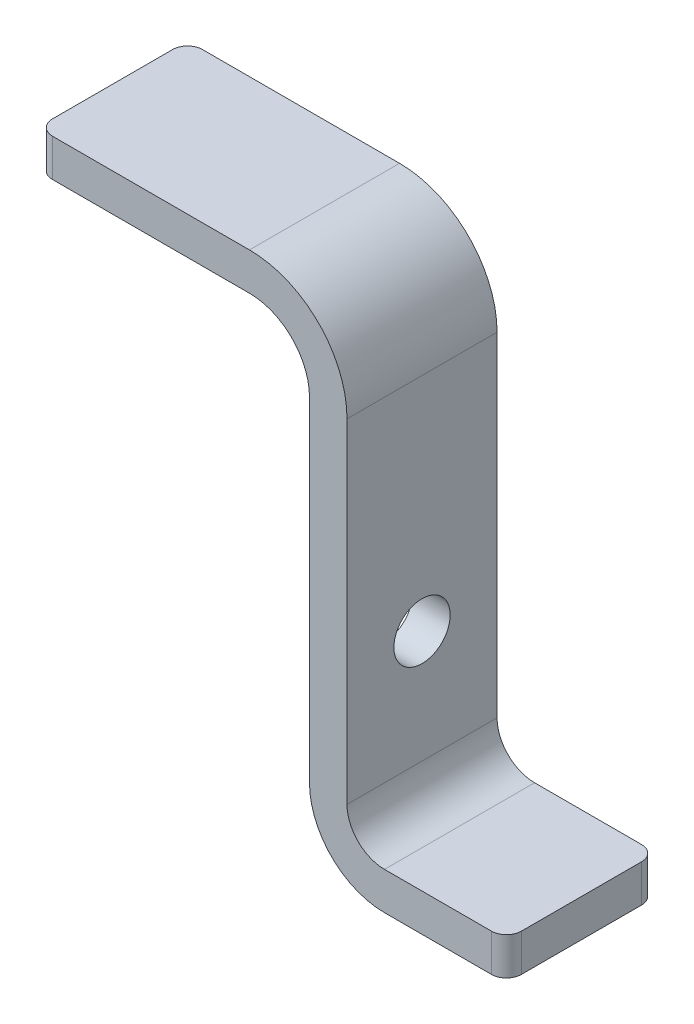
ISO-10303-21;
HEADER;
FILE_DESCRIPTION(('STEP AP214'),'2;1');
FILE_NAME('part.step','',(''),(''),'','','');
FILE_SCHEMA(('AUTOMOTIVE_DESIGN { 1 0 10303 214 1 1 1 1 }'));
ENDSEC;
DATA;
#1=APPLICATION_CONTEXT('core data for automotive mechanical design processes');
#2=APPLICATION_PROTOCOL_DEFINITION('international standard','automotive_design',2000,#1);
#3=PRODUCT_CONTEXT('',#1,'mechanical');
#4=PRODUCT('Part','Part','',(#3));
#5=PRODUCT_RELATED_PRODUCT_CATEGORY('part','',(#4));
#6=PRODUCT_DEFINITION_FORMATION('','',#4);
#7=PRODUCT_DEFINITION_CONTEXT('part definition',#1,'design');
#8=PRODUCT_DEFINITION('design','',#6,#7);
#9=PRODUCT_DEFINITION_SHAPE('','',#8);
#10=(LENGTH_UNIT() NAMED_UNIT(*) SI_UNIT(.MILLI.,.METRE.));
#11=(NAMED_UNIT(*) PLANE_ANGLE_UNIT() SI_UNIT($,.RADIAN.));
#12=(NAMED_UNIT(*) SI_UNIT($,.STERADIAN.) SOLID_ANGLE_UNIT());
#13=UNCERTAINTY_MEASURE_WITH_UNIT(LENGTH_MEASURE(1.E-05),#10,'distance_accuracy_value','');
#14=(GEOMETRIC_REPRESENTATION_CONTEXT(3) GLOBAL_UNCERTAINTY_ASSIGNED_CONTEXT((#13)) GLOBAL_UNIT_ASSIGNED_CONTEXT((#10,
#11,#12)) REPRESENTATION_CONTEXT('',''));
#15=CARTESIAN_POINT('',(0.,0.,0.));
#16=DIRECTION('',(0.,0.,1.));
#17=DIRECTION('',(1.,0.,0.));
#18=AXIS2_PLACEMENT_3D('',#15,#16,#17);
#19=CARTESIAN_POINT('',(0.,32.3835672931705,-25.4));
#20=DIRECTION('',(-1.,0.,0.));
#21=DIRECTION('',(0.,0.,1.));
#22=AXIS2_PLACEMENT_3D('',#19,#20,#21);
#23=PLANE('',#22);
#24=DIRECTION('',(0.,0.,1.));
#25=VECTOR('',#24,1.);
#26=CARTESIAN_POINT('',(0.,38.7335672931705,-25.4));
#27=LINE('',#26,#25);
#28=CARTESIAN_POINT('',(0.,38.7335672931705,-22.86));
#29=VERTEX_POINT('',#28);
#30=CARTESIAN_POINT('',(0.,38.7335672931705,-2.54));
#31=VERTEX_POINT('',#30);
#32=EDGE_CURVE('E225',#29,#31,#27,.T.);
#33=ORIENTED_EDGE('',*,*,#32,.F.);
#34=DIRECTION('',(0.,-1.,0.));
#35=VECTOR('',#34,1.);
#36=CARTESIAN_POINT('',(0.,32.3835672931705,-22.86));
#37=LINE('',#36,#35);
#38=CARTESIAN_POINT('',(0.,32.3835672931705,-22.86));
#39=VERTEX_POINT('',#38);
#40=EDGE_CURVE('E251',#29,#39,#37,.T.);
#41=ORIENTED_EDGE('',*,*,#40,.T.);
#42=DIRECTION('',(0.,0.,1.));
#43=VECTOR('',#42,1.);
#44=CARTESIAN_POINT('',(0.,32.3835672931705,-25.4));
#45=LINE('',#44,#43);
#46=CARTESIAN_POINT('',(0.,32.3835672931705,-2.54));
#47=VERTEX_POINT('',#46);
#48=EDGE_CURVE('E169',#39,#47,#45,.T.);
#49=ORIENTED_EDGE('',*,*,#48,.T.);
#50=DIRECTION('',(0.,-1.,0.));
#51=VECTOR('',#50,1.);
#52=CARTESIAN_POINT('',(0.,38.7335672931705,-2.54));
#53=LINE('',#52,#51);
#54=EDGE_CURVE('E228',#47,#31,#53,.F.);
#55=ORIENTED_EDGE('',*,*,#54,.T.);
#56=EDGE_LOOP('',(#33,#41,#49,#55));
#57=FACE_BOUND('',#56,.T.);
#58=ADVANCED_FACE('F34',(#57),#23,.T.);
#59=CARTESIAN_POINT('',(0.,38.7335672931705,-25.4));
#60=DIRECTION('',(0.,1.,0.));
#61=DIRECTION('',(0.,0.,1.));
#62=AXIS2_PLACEMENT_3D('',#59,#60,#61);
#63=PLANE('',#62);
#64=DIRECTION('',(-1.,0.,0.));
#65=VECTOR('',#64,1.);
#66=CARTESIAN_POINT('',(0.,38.7335672931705,-25.4));
#67=LINE('',#66,#65);
#68=CARTESIAN_POINT('',(35.8775,38.7335672931705,-25.4));
#69=VERTEX_POINT('',#68);
#70=CARTESIAN_POINT('',(2.54,38.7335672931705,-25.4));
#71=VERTEX_POINT('',#70);
#72=EDGE_CURVE('E197',#69,#71,#67,.T.);
#73=ORIENTED_EDGE('',*,*,#72,.T.);
#74=CARTESIAN_POINT('',(2.54,38.7335672931705,-22.86));
#75=DIRECTION('',(0.,1.,0.));
#76=DIRECTION('',(0.,0.,1.));
#77=AXIS2_PLACEMENT_3D('',#74,#75,#76);
#78=CIRCLE('',#77,2.54);
#79=EDGE_CURVE('E263',#71,#29,#78,.T.);
#80=ORIENTED_EDGE('',*,*,#79,.T.);
#81=ORIENTED_EDGE('',*,*,#32,.T.);
#82=CARTESIAN_POINT('',(2.54,38.7335672931705,-2.54));
#83=DIRECTION('',(0.,1.,0.));
#84=DIRECTION('',(0.,0.,1.));
#85=AXIS2_PLACEMENT_3D('',#82,#83,#84);
#86=CIRCLE('',#85,2.54);
#87=CARTESIAN_POINT('',(2.54,38.7335672931705,0.));
#88=VERTEX_POINT('',#87);
#89=EDGE_CURVE('E261',#31,#88,#86,.T.);
#90=ORIENTED_EDGE('',*,*,#89,.T.);
#91=DIRECTION('',(-1.,0.,0.));
#92=VECTOR('',#91,1.);
#93=CARTESIAN_POINT('',(0.,38.7335672931705,0.));
#94=LINE('',#93,#92);
#95=CARTESIAN_POINT('',(35.8775,38.7335672931705,0.));
#96=VERTEX_POINT('',#95);
#97=EDGE_CURVE('E161',#96,#88,#94,.T.);
#98=ORIENTED_EDGE('',*,*,#97,.F.);
#99=DIRECTION('',(0.,0.,1.));
#100=VECTOR('',#99,1.);
#101=CARTESIAN_POINT('',(35.8775,38.7335672931705,-25.4));
#102=LINE('',#101,#100);
#103=EDGE_CURVE('E229',#69,#96,#102,.T.);
#104=ORIENTED_EDGE('',*,*,#103,.F.);
#105=EDGE_LOOP('',(#73,#80,#81,#90,#98,#104));
#106=FACE_BOUND('',#105,.T.);
#107=ADVANCED_FACE('F313',(#106),#63,.T.);
#108=CARTESIAN_POINT('',(35.8775,22.2235672931705,-25.4));
#109=DIRECTION('',(0.,0.,1.));
#110=DIRECTION('',(1.,0.,0.));
#111=AXIS2_PLACEMENT_3D('',#108,#109,#110);
#112=CYLINDRICAL_SURFACE('',#111,16.51);
#113=CARTESIAN_POINT('',(35.8775,22.2235672931705,0.));
#114=DIRECTION('',(0.,0.,1.));
#115=DIRECTION('',(-1.,0.,0.));
#116=AXIS2_PLACEMENT_3D('',#113,#114,#115);
#117=CIRCLE('',#116,16.51);
#118=CARTESIAN_POINT('',(52.3875,22.2235672931705,0.));
#119=VERTEX_POINT('',#118);
#120=EDGE_CURVE('E220',#119,#96,#117,.T.);
#121=ORIENTED_EDGE('',*,*,#120,.F.);
#122=DIRECTION('',(0.,0.,1.));
#123=VECTOR('',#122,1.);
#124=CARTESIAN_POINT('',(52.3875,22.2235672931705,-25.4));
#125=LINE('',#124,#123);
#126=CARTESIAN_POINT('',(52.3875,22.2235672931705,-25.4));
#127=VERTEX_POINT('',#126);
#128=EDGE_CURVE('E231',#127,#119,#125,.T.);
#129=ORIENTED_EDGE('',*,*,#128,.F.);
#130=CARTESIAN_POINT('',(35.8775,22.2235672931705,-25.4));
#131=DIRECTION('',(0.,0.,1.));
#132=DIRECTION('',(-1.,0.,0.));
#133=AXIS2_PLACEMENT_3D('',#130,#131,#132);
#134=CIRCLE('',#133,16.51);
#135=EDGE_CURVE('E194',#127,#69,#134,.T.);
#136=ORIENTED_EDGE('',*,*,#135,.T.);
#137=ORIENTED_EDGE('',*,*,#103,.T.);
#138=EDGE_LOOP('',(#121,#129,#136,#137));
#139=FACE_BOUND('',#138,.T.);
#140=ADVANCED_FACE('F317',(#139),#112,.T.);
#141=CARTESIAN_POINT('',(52.3875,22.2235672931705,-25.4));
#142=DIRECTION('',(1.,0.,0.));
#143=DIRECTION('',(0.,1.,0.));
#144=AXIS2_PLACEMENT_3D('',#141,#142,#143);
#145=PLANE('',#144);
#146=CARTESIAN_POINT('',(52.3875,-15.2414327068295,-12.7));
#147=DIRECTION('',(1.,0.,0.));
#148=DIRECTION('',(0.,1.,0.));
#149=AXIS2_PLACEMENT_3D('',#146,#147,#148);
#150=CIRCLE('',#149,4.7625);
#151=CARTESIAN_POINT('',(52.3875,-10.4789327068295,-12.7));
#152=VERTEX_POINT('',#151);
#153=EDGE_CURVE('E376',#152,#152,#150,.T.);
#154=ORIENTED_EDGE('',*,*,#153,.F.);
#155=EDGE_LOOP('',(#154));
#156=FACE_BOUND('',#155,.T.);
#157=DIRECTION('',(0.,1.,0.));
#158=VECTOR('',#157,1.);
#159=CARTESIAN_POINT('',(52.3875,22.2235672931705,0.));
#160=LINE('',#159,#158);
#161=CARTESIAN_POINT('',(52.3875,-34.2914327068295,0.));
#162=VERTEX_POINT('',#161);
#163=EDGE_CURVE('E217',#162,#119,#160,.T.);
#164=ORIENTED_EDGE('',*,*,#163,.F.);
#165=DIRECTION('',(0.,0.,1.));
#166=VECTOR('',#165,1.);
#167=CARTESIAN_POINT('',(52.3875,-34.2914327068295,-25.4));
#168=LINE('',#167,#166);
#169=CARTESIAN_POINT('',(52.3875,-34.2914327068295,-25.4));
#170=VERTEX_POINT('',#169);
#171=EDGE_CURVE('E233',#170,#162,#168,.T.);
#172=ORIENTED_EDGE('',*,*,#171,.F.);
#173=DIRECTION('',(0.,1.,0.));
#174=VECTOR('',#173,1.);
#175=CARTESIAN_POINT('',(52.3875,22.2235672931705,-25.4));
#176=LINE('',#175,#174);
#177=EDGE_CURVE('E191',#170,#127,#176,.T.);
#178=ORIENTED_EDGE('',*,*,#177,.T.);
#179=ORIENTED_EDGE('',*,*,#128,.T.);
#180=EDGE_LOOP('',(#164,#172,#178,#179));
#181=FACE_BOUND('',#180,.T.);
#182=ADVANCED_FACE('F356',(#156,#181),#145,.T.);
#183=CARTESIAN_POINT('',(58.7375,-34.2914327068295,-25.4));
#184=DIRECTION('',(0.,0.,1.));
#185=DIRECTION('',(1.,0.,0.));
#186=AXIS2_PLACEMENT_3D('',#183,#184,#185);
#187=CYLINDRICAL_SURFACE('',#186,6.35);
#188=CARTESIAN_POINT('',(58.7375,-34.2914327068295,0.));
#189=DIRECTION('',(0.,0.,-1.));
#190=DIRECTION('',(1.,0.,0.));
#191=AXIS2_PLACEMENT_3D('',#188,#189,#190);
#192=CIRCLE('',#191,6.35);
#193=CARTESIAN_POINT('',(58.7375,-40.6414327068295,0.));
#194=VERTEX_POINT('',#193);
#195=EDGE_CURVE('E214',#194,#162,#192,.T.);
#196=ORIENTED_EDGE('',*,*,#195,.F.);
#197=DIRECTION('',(0.,0.,1.));
#198=VECTOR('',#197,1.);
#199=CARTESIAN_POINT('',(58.7375,-40.6414327068295,-25.4));
#200=LINE('',#199,#198);
#201=CARTESIAN_POINT('',(58.7375,-40.6414327068295,-25.4));
#202=VERTEX_POINT('',#201);
#203=EDGE_CURVE('E235',#202,#194,#200,.T.);
#204=ORIENTED_EDGE('',*,*,#203,.F.);
#205=CARTESIAN_POINT('',(58.7375,-34.2914327068295,-25.4));
#206=DIRECTION('',(0.,0.,-1.));
#207=DIRECTION('',(1.,0.,0.));
#208=AXIS2_PLACEMENT_3D('',#205,#206,#207);
#209=CIRCLE('',#208,6.35);
#210=EDGE_CURVE('E188',#202,#170,#209,.T.);
#211=ORIENTED_EDGE('',*,*,#210,.T.);
#212=ORIENTED_EDGE('',*,*,#171,.T.);
#213=EDGE_LOOP('',(#196,#204,#211,#212));
#214=FACE_BOUND('',#213,.T.);
#215=ADVANCED_FACE('F353',(#214),#187,.F.);
#216=CARTESIAN_POINT('',(58.7375,-40.6414327068295,-25.4));
#217=DIRECTION('',(0.,1.,0.));
#218=DIRECTION('',(0.,0.,1.));
#219=AXIS2_PLACEMENT_3D('',#216,#217,#218);
#220=PLANE('',#219);
#221=DIRECTION('',(0.,0.,1.));
#222=VECTOR('',#221,1.);
#223=CARTESIAN_POINT('',(79.375,-40.6414327068295,-25.4));
#224=LINE('',#223,#222);
#225=CARTESIAN_POINT('',(79.375,-40.6414327068295,-22.86));
#226=VERTEX_POINT('',#225);
#227=CARTESIAN_POINT('',(79.375,-40.6414327068295,-2.54));
#228=VERTEX_POINT('',#227);
#229=EDGE_CURVE('E238',#226,#228,#224,.T.);
#230=ORIENTED_EDGE('',*,*,#229,.F.);
#231=CARTESIAN_POINT('',(76.835,-40.6414327068295,-22.86));
#232=DIRECTION('',(0.,1.,0.));
#233=DIRECTION('',(0.,0.,1.));
#234=AXIS2_PLACEMENT_3D('',#231,#232,#233);
#235=CIRCLE('',#234,2.54);
#236=CARTESIAN_POINT('',(76.835,-40.6414327068295,-25.4));
#237=VERTEX_POINT('',#236);
#238=EDGE_CURVE('E58',#226,#237,#235,.T.);
#239=ORIENTED_EDGE('',*,*,#238,.T.);
#240=DIRECTION('',(-1.,0.,0.));
#241=VECTOR('',#240,1.);
#242=CARTESIAN_POINT('',(58.7375,-40.6414327068295,-25.4));
#243=LINE('',#242,#241);
#244=EDGE_CURVE('E186',#237,#202,#243,.T.);
#245=ORIENTED_EDGE('',*,*,#244,.T.);
#246=ORIENTED_EDGE('',*,*,#203,.T.);
#247=DIRECTION('',(-1.,0.,0.));
#248=VECTOR('',#247,1.);
#249=CARTESIAN_POINT('',(58.7375,-40.6414327068295,0.));
#250=LINE('',#249,#248);
#251=CARTESIAN_POINT('',(76.835,-40.6414327068295,0.));
#252=VERTEX_POINT('',#251);
#253=EDGE_CURVE('E212',#252,#194,#250,.T.);
#254=ORIENTED_EDGE('',*,*,#253,.F.);
#255=CARTESIAN_POINT('',(76.835,-40.6414327068295,-2.54));
#256=DIRECTION('',(0.,1.,0.));
#257=DIRECTION('',(0.,0.,1.));
#258=AXIS2_PLACEMENT_3D('',#255,#256,#257);
#259=CIRCLE('',#258,2.54);
#260=EDGE_CURVE('E50',#252,#228,#259,.T.);
#261=ORIENTED_EDGE('',*,*,#260,.T.);
#262=EDGE_LOOP('',(#230,#239,#245,#246,#254,#261));
#263=FACE_BOUND('',#262,.T.);
#264=ADVANCED_FACE('F290',(#263),#220,.T.);
#265=CARTESIAN_POINT('',(79.375,-46.9914327068295,-25.4));
#266=DIRECTION('',(1.,0.,0.));
#267=DIRECTION('',(0.,0.,-1.));
#268=AXIS2_PLACEMENT_3D('',#265,#266,#267);
#269=PLANE('',#268);
#270=DIRECTION('',(0.,0.,1.));
#271=VECTOR('',#270,1.);
#272=CARTESIAN_POINT('',(79.375,-46.9914327068295,-25.4));
#273=LINE('',#272,#271);
#274=CARTESIAN_POINT('',(79.375,-46.9914327068295,-22.86));
#275=VERTEX_POINT('',#274);
#276=CARTESIAN_POINT('',(79.375,-46.9914327068295,-2.54));
#277=VERTEX_POINT('',#276);
#278=EDGE_CURVE('E240',#275,#277,#273,.T.);
#279=ORIENTED_EDGE('',*,*,#278,.F.);
#280=DIRECTION('',(0.,1.,0.));
#281=VECTOR('',#280,1.);
#282=CARTESIAN_POINT('',(79.375,-46.9914327068295,-22.86));
#283=LINE('',#282,#281);
#284=EDGE_CURVE('E273',#275,#226,#283,.T.);
#285=ORIENTED_EDGE('',*,*,#284,.T.);
#286=ORIENTED_EDGE('',*,*,#229,.T.);
#287=DIRECTION('',(0.,1.,0.));
#288=VECTOR('',#287,1.);
#289=CARTESIAN_POINT('',(79.375,-46.9914327068295,-2.54));
#290=LINE('',#289,#288);
#291=EDGE_CURVE('E271',#228,#277,#290,.F.);
#292=ORIENTED_EDGE('',*,*,#291,.T.);
#293=EDGE_LOOP('',(#279,#285,#286,#292));
#294=FACE_BOUND('',#293,.T.);
#295=ADVANCED_FACE('F289',(#294),#269,.T.);
#296=CARTESIAN_POINT('',(58.7375,-46.9914327068295,-25.4));
#297=DIRECTION('',(0.,-1.,0.));
#298=DIRECTION('',(0.,0.,-1.));
#299=AXIS2_PLACEMENT_3D('',#296,#297,#298);
#300=PLANE('',#299);
#301=DIRECTION('',(1.,0.,0.));
#302=VECTOR('',#301,1.);
#303=CARTESIAN_POINT('',(58.7375,-46.9914327068295,-25.4));
#304=LINE('',#303,#302);
#305=CARTESIAN_POINT('',(58.7375,-46.9914327068295,-25.4));
#306=VERTEX_POINT('',#305);
#307=CARTESIAN_POINT('',(76.835,-46.9914327068295,-25.4));
#308=VERTEX_POINT('',#307);
#309=EDGE_CURVE('E183',#306,#308,#304,.T.);
#310=ORIENTED_EDGE('',*,*,#309,.T.);
#311=CARTESIAN_POINT('',(76.835,-46.9914327068295,-22.86));
#312=DIRECTION('',(0.,-1.,0.));
#313=DIRECTION('',(0.,0.,-1.));
#314=AXIS2_PLACEMENT_3D('',#311,#312,#313);
#315=CIRCLE('',#314,2.54);
#316=EDGE_CURVE('E11',#308,#275,#315,.T.);
#317=ORIENTED_EDGE('',*,*,#316,.T.);
#318=ORIENTED_EDGE('',*,*,#278,.T.);
#319=CARTESIAN_POINT('',(76.835,-46.9914327068295,-2.54));
#320=DIRECTION('',(0.,-1.,0.));
#321=DIRECTION('',(0.,0.,-1.));
#322=AXIS2_PLACEMENT_3D('',#319,#320,#321);
#323=CIRCLE('',#322,2.54);
#324=CARTESIAN_POINT('',(76.835,-46.9914327068295,0.));
#325=VERTEX_POINT('',#324);
#326=EDGE_CURVE('E43',#277,#325,#323,.T.);
#327=ORIENTED_EDGE('',*,*,#326,.T.);
#328=DIRECTION('',(1.,0.,0.));
#329=VECTOR('',#328,1.);
#330=CARTESIAN_POINT('',(58.7375,-46.9914327068295,0.));
#331=LINE('',#330,#329);
#332=CARTESIAN_POINT('',(58.7375,-46.9914327068295,0.));
#333=VERTEX_POINT('',#332);
#334=EDGE_CURVE('E209',#333,#325,#331,.T.);
#335=ORIENTED_EDGE('',*,*,#334,.F.);
#336=DIRECTION('',(0.,0.,1.));
#337=VECTOR('',#336,1.);
#338=CARTESIAN_POINT('',(58.7375,-46.9914327068295,-25.4));
#339=LINE('',#338,#337);
#340=EDGE_CURVE('E243',#306,#333,#339,.T.);
#341=ORIENTED_EDGE('',*,*,#340,.F.);
#342=EDGE_LOOP('',(#310,#317,#318,#327,#335,#341));
#343=FACE_BOUND('',#342,.T.);
#344=ADVANCED_FACE('F280',(#343),#300,.T.);
#345=CARTESIAN_POINT('',(58.7375,-34.2914327068295,-25.4));
#346=DIRECTION('',(0.,0.,1.));
#347=DIRECTION('',(1.,0.,0.));
#348=AXIS2_PLACEMENT_3D('',#345,#346,#347);
#349=CYLINDRICAL_SURFACE('',#348,12.7);
#350=CARTESIAN_POINT('',(58.7375,-34.2914327068295,0.));
#351=DIRECTION('',(0.,0.,1.));
#352=DIRECTION('',(1.,0.,0.));
#353=AXIS2_PLACEMENT_3D('',#350,#351,#352);
#354=CIRCLE('',#353,12.7);
#355=CARTESIAN_POINT('',(46.0375,-34.2914327068295,0.));
#356=VERTEX_POINT('',#355);
#357=EDGE_CURVE('E206',#356,#333,#354,.T.);
#358=ORIENTED_EDGE('',*,*,#357,.F.);
#359=DIRECTION('',(0.,0.,1.));
#360=VECTOR('',#359,1.);
#361=CARTESIAN_POINT('',(46.0375,-34.2914327068295,-25.4));
#362=LINE('',#361,#360);
#363=CARTESIAN_POINT('',(46.0375,-34.2914327068295,-25.4));
#364=VERTEX_POINT('',#363);
#365=EDGE_CURVE('E245',#364,#356,#362,.T.);
#366=ORIENTED_EDGE('',*,*,#365,.F.);
#367=CARTESIAN_POINT('',(58.7375,-34.2914327068295,-25.4));
#368=DIRECTION('',(0.,0.,1.));
#369=DIRECTION('',(1.,0.,0.));
#370=AXIS2_PLACEMENT_3D('',#367,#368,#369);
#371=CIRCLE('',#370,12.7);
#372=EDGE_CURVE('E177',#364,#306,#371,.T.);
#373=ORIENTED_EDGE('',*,*,#372,.T.);
#374=ORIENTED_EDGE('',*,*,#340,.T.);
#375=EDGE_LOOP('',(#358,#366,#373,#374));
#376=FACE_BOUND('',#375,.T.);
#377=ADVANCED_FACE('F299',(#376),#349,.T.);
#378=CARTESIAN_POINT('',(46.0375,22.2235672931705,-25.4));
#379=DIRECTION('',(-1.,0.,0.));
#380=DIRECTION('',(0.,-1.,0.));
#381=AXIS2_PLACEMENT_3D('',#378,#379,#380);
#382=PLANE('',#381);
#383=CARTESIAN_POINT('',(46.0375,-15.2414327068295,-12.7));
#384=DIRECTION('',(-1.,0.,0.));
#385=DIRECTION('',(0.,-1.,0.));
#386=AXIS2_PLACEMENT_3D('',#383,#384,#385);
#387=CIRCLE('',#386,4.7625);
#388=CARTESIAN_POINT('',(46.0375,-20.0039327068295,-12.7));
#389=VERTEX_POINT('',#388);
#390=EDGE_CURVE('E38',#389,#389,#387,.T.);
#391=ORIENTED_EDGE('',*,*,#390,.F.);
#392=EDGE_LOOP('',(#391));
#393=FACE_BOUND('',#392,.T.);
#394=DIRECTION('',(0.,-1.,0.));
#395=VECTOR('',#394,1.);
#396=CARTESIAN_POINT('',(46.0375,22.2235672931705,0.));
#397=LINE('',#396,#395);
#398=CARTESIAN_POINT('',(46.0375,22.2235672931705,0.));
#399=VERTEX_POINT('',#398);
#400=EDGE_CURVE('E203',#399,#356,#397,.T.);
#401=ORIENTED_EDGE('',*,*,#400,.F.);
#402=DIRECTION('',(0.,0.,1.));
#403=VECTOR('',#402,1.);
#404=CARTESIAN_POINT('',(46.0375,22.2235672931705,-25.4));
#405=LINE('',#404,#403);
#406=CARTESIAN_POINT('',(46.0375,22.2235672931705,-25.4));
#407=VERTEX_POINT('',#406);
#408=EDGE_CURVE('E168',#407,#399,#405,.T.);
#409=ORIENTED_EDGE('',*,*,#408,.F.);
#410=DIRECTION('',(0.,-1.,0.));
#411=VECTOR('',#410,1.);
#412=CARTESIAN_POINT('',(46.0375,22.2235672931705,-25.4));
#413=LINE('',#412,#411);
#414=EDGE_CURVE('E175',#407,#364,#413,.T.);
#415=ORIENTED_EDGE('',*,*,#414,.T.);
#416=ORIENTED_EDGE('',*,*,#365,.T.);
#417=EDGE_LOOP('',(#401,#409,#415,#416));
#418=FACE_BOUND('',#417,.T.);
#419=ADVANCED_FACE('F302',(#393,#418),#382,.T.);
#420=CARTESIAN_POINT('',(35.8775,22.2235672931705,-25.4));
#421=DIRECTION('',(0.,0.,1.));
#422=DIRECTION('',(1.,0.,0.));
#423=AXIS2_PLACEMENT_3D('',#420,#421,#422);
#424=CYLINDRICAL_SURFACE('',#423,10.16);
#425=CARTESIAN_POINT('',(35.8775,22.2235672931705,0.));
#426=DIRECTION('',(0.,0.,-1.));
#427=DIRECTION('',(-1.,0.,0.));
#428=AXIS2_PLACEMENT_3D('',#425,#426,#427);
#429=CIRCLE('',#428,10.16);
#430=CARTESIAN_POINT('',(35.8775,32.3835672931705,0.));
#431=VERTEX_POINT('',#430);
#432=EDGE_CURVE('E167',#431,#399,#429,.T.);
#433=ORIENTED_EDGE('',*,*,#432,.F.);
#434=DIRECTION('',(0.,0.,1.));
#435=VECTOR('',#434,1.);
#436=CARTESIAN_POINT('',(35.8775,32.3835672931705,-25.4));
#437=LINE('',#436,#435);
#438=CARTESIAN_POINT('',(35.8775,32.3835672931705,-25.4));
#439=VERTEX_POINT('',#438);
#440=EDGE_CURVE('E154',#439,#431,#437,.T.);
#441=ORIENTED_EDGE('',*,*,#440,.F.);
#442=CARTESIAN_POINT('',(35.8775,22.2235672931705,-25.4));
#443=DIRECTION('',(0.,0.,-1.));
#444=DIRECTION('',(-1.,0.,0.));
#445=AXIS2_PLACEMENT_3D('',#442,#443,#444);
#446=CIRCLE('',#445,10.16);
#447=EDGE_CURVE('E160',#439,#407,#446,.T.);
#448=ORIENTED_EDGE('',*,*,#447,.T.);
#449=ORIENTED_EDGE('',*,*,#408,.T.);
#450=EDGE_LOOP('',(#433,#441,#448,#449));
#451=FACE_BOUND('',#450,.T.);
#452=ADVANCED_FACE('F165',(#451),#424,.F.);
#453=CARTESIAN_POINT('',(0.,32.3835672931705,-25.4));
#454=DIRECTION('',(0.,-1.,0.));
#455=DIRECTION('',(0.,0.,-1.));
#456=AXIS2_PLACEMENT_3D('',#453,#454,#455);
#457=PLANE('',#456);
#458=ORIENTED_EDGE('',*,*,#48,.F.);
#459=CARTESIAN_POINT('',(2.54,32.3835672931705,-22.86));
#460=DIRECTION('',(0.,-1.,0.));
#461=DIRECTION('',(0.,0.,-1.));
#462=AXIS2_PLACEMENT_3D('',#459,#460,#461);
#463=CIRCLE('',#462,2.54);
#464=CARTESIAN_POINT('',(2.54,32.3835672931705,-25.4));
#465=VERTEX_POINT('',#464);
#466=EDGE_CURVE('E156',#39,#465,#463,.T.);
#467=ORIENTED_EDGE('',*,*,#466,.T.);
#468=DIRECTION('',(1.,0.,0.));
#469=VECTOR('',#468,1.);
#470=CARTESIAN_POINT('',(0.,32.3835672931705,-25.4));
#471=LINE('',#470,#469);
#472=EDGE_CURVE('E149',#465,#439,#471,.T.);
#473=ORIENTED_EDGE('',*,*,#472,.T.);
#474=ORIENTED_EDGE('',*,*,#440,.T.);
#475=DIRECTION('',(1.,0.,0.));
#476=VECTOR('',#475,1.);
#477=CARTESIAN_POINT('',(0.,32.3835672931705,0.));
#478=LINE('',#477,#476);
#479=CARTESIAN_POINT('',(2.54,32.3835672931705,0.));
#480=VERTEX_POINT('',#479);
#481=EDGE_CURVE('E200',#480,#431,#478,.T.);
#482=ORIENTED_EDGE('',*,*,#481,.F.);
#483=CARTESIAN_POINT('',(2.54,32.3835672931705,-2.54));
#484=DIRECTION('',(0.,-1.,0.));
#485=DIRECTION('',(0.,0.,-1.));
#486=AXIS2_PLACEMENT_3D('',#483,#484,#485);
#487=CIRCLE('',#486,2.54);
#488=EDGE_CURVE('E254',#480,#47,#487,.T.);
#489=ORIENTED_EDGE('',*,*,#488,.T.);
#490=EDGE_LOOP('',(#458,#467,#473,#474,#482,#489));
#491=FACE_BOUND('',#490,.T.);
#492=ADVANCED_FACE('F152',(#491),#457,.T.);
#493=CARTESIAN_POINT('',(35.8775,22.2235672931705,-25.4));
#494=DIRECTION('',(0.,0.,-1.));
#495=DIRECTION('',(-1.,0.,0.));
#496=AXIS2_PLACEMENT_3D('',#493,#494,#495);
#497=PLANE('',#496);
#498=ORIENTED_EDGE('',*,*,#472,.F.);
#499=DIRECTION('',(0.,-1.,0.));
#500=VECTOR('',#499,1.);
#501=CARTESIAN_POINT('',(2.54,22.2235672931705,-25.4));
#502=LINE('',#501,#500);
#503=EDGE_CURVE('E259',#465,#71,#502,.F.);
#504=ORIENTED_EDGE('',*,*,#503,.T.);
#505=ORIENTED_EDGE('',*,*,#72,.F.);
#506=ORIENTED_EDGE('',*,*,#135,.F.);
#507=ORIENTED_EDGE('',*,*,#177,.F.);
#508=ORIENTED_EDGE('',*,*,#210,.F.);
#509=ORIENTED_EDGE('',*,*,#244,.F.);
#510=DIRECTION('',(0.,1.,0.));
#511=VECTOR('',#510,1.);
#512=CARTESIAN_POINT('',(76.835,22.2235672931705,-25.4));
#513=LINE('',#512,#511);
#514=EDGE_CURVE('E257',#237,#308,#513,.F.);
#515=ORIENTED_EDGE('',*,*,#514,.T.);
#516=ORIENTED_EDGE('',*,*,#309,.F.);
#517=ORIENTED_EDGE('',*,*,#372,.F.);
#518=ORIENTED_EDGE('',*,*,#414,.F.);
#519=ORIENTED_EDGE('',*,*,#447,.F.);
#520=EDGE_LOOP('',(#498,#504,#505,#506,#507,#508,#509,#515,#516,#517,#518,#519));
#521=FACE_BOUND('',#520,.T.);
#522=ADVANCED_FACE('F172',(#521),#497,.T.);
#523=CARTESIAN_POINT('',(35.8775,22.2235672931705,0.));
#524=DIRECTION('',(0.,0.,-1.));
#525=DIRECTION('',(-1.,0.,0.));
#526=AXIS2_PLACEMENT_3D('',#523,#524,#525);
#527=PLANE('',#526);
#528=ORIENTED_EDGE('',*,*,#97,.T.);
#529=DIRECTION('',(0.,-1.,0.));
#530=VECTOR('',#529,1.);
#531=CARTESIAN_POINT('',(2.54,32.3835672931705,0.));
#532=LINE('',#531,#530);
#533=EDGE_CURVE('E268',#88,#480,#532,.T.);
#534=ORIENTED_EDGE('',*,*,#533,.T.);
#535=ORIENTED_EDGE('',*,*,#481,.T.);
#536=ORIENTED_EDGE('',*,*,#432,.T.);
#537=ORIENTED_EDGE('',*,*,#400,.T.);
#538=ORIENTED_EDGE('',*,*,#357,.T.);
#539=ORIENTED_EDGE('',*,*,#334,.T.);
#540=DIRECTION('',(0.,1.,0.));
#541=VECTOR('',#540,1.);
#542=CARTESIAN_POINT('',(76.835,-40.6414327068295,0.));
#543=LINE('',#542,#541);
#544=EDGE_CURVE('E265',#325,#252,#543,.T.);
#545=ORIENTED_EDGE('',*,*,#544,.T.);
#546=ORIENTED_EDGE('',*,*,#253,.T.);
#547=ORIENTED_EDGE('',*,*,#195,.T.);
#548=ORIENTED_EDGE('',*,*,#163,.T.);
#549=ORIENTED_EDGE('',*,*,#120,.T.);
#550=EDGE_LOOP('',(#528,#534,#535,#536,#537,#538,#539,#545,#546,#547,#548,#549));
#551=FACE_BOUND('',#550,.T.);
#552=ADVANCED_FACE('F286',(#551),#527,.F.);
#553=CARTESIAN_POINT('',(2.54,32.3835672931705,-22.86));
#554=DIRECTION('',(0.,-1.,0.));
#555=DIRECTION('',(0.,0.,-1.));
#556=AXIS2_PLACEMENT_3D('',#553,#554,#555);
#557=CYLINDRICAL_SURFACE('',#556,2.54);
#558=ORIENTED_EDGE('',*,*,#79,.F.);
#559=ORIENTED_EDGE('',*,*,#503,.F.);
#560=ORIENTED_EDGE('',*,*,#466,.F.);
#561=ORIENTED_EDGE('',*,*,#40,.F.);
#562=EDGE_LOOP('',(#558,#559,#560,#561));
#563=FACE_BOUND('',#562,.T.);
#564=ADVANCED_FACE('F322',(#563),#557,.T.);
#565=CARTESIAN_POINT('',(2.54,22.2235672931705,-2.54));
#566=DIRECTION('',(0.,1.,0.));
#567=DIRECTION('',(0.,0.,1.));
#568=AXIS2_PLACEMENT_3D('',#565,#566,#567);
#569=CYLINDRICAL_SURFACE('',#568,2.54);
#570=ORIENTED_EDGE('',*,*,#89,.F.);
#571=ORIENTED_EDGE('',*,*,#54,.F.);
#572=ORIENTED_EDGE('',*,*,#488,.F.);
#573=ORIENTED_EDGE('',*,*,#533,.F.);
#574=EDGE_LOOP('',(#570,#571,#572,#573));
#575=FACE_BOUND('',#574,.T.);
#576=ADVANCED_FACE('F310',(#575),#569,.T.);
#577=CARTESIAN_POINT('',(76.835,-46.9914327068295,-22.86));
#578=DIRECTION('',(0.,1.,0.));
#579=DIRECTION('',(0.,0.,1.));
#580=AXIS2_PLACEMENT_3D('',#577,#578,#579);
#581=CYLINDRICAL_SURFACE('',#580,2.54);
#582=ORIENTED_EDGE('',*,*,#316,.F.);
#583=ORIENTED_EDGE('',*,*,#514,.F.);
#584=ORIENTED_EDGE('',*,*,#238,.F.);
#585=ORIENTED_EDGE('',*,*,#284,.F.);
#586=EDGE_LOOP('',(#582,#583,#584,#585));
#587=FACE_BOUND('',#586,.T.);
#588=ADVANCED_FACE('F297',(#587),#581,.T.);
#589=CARTESIAN_POINT('',(76.835,22.2235672931705,-2.54));
#590=DIRECTION('',(0.,-1.,0.));
#591=DIRECTION('',(0.,0.,-1.));
#592=AXIS2_PLACEMENT_3D('',#589,#590,#591);
#593=CYLINDRICAL_SURFACE('',#592,2.54);
#594=ORIENTED_EDGE('',*,*,#326,.F.);
#595=ORIENTED_EDGE('',*,*,#291,.F.);
#596=ORIENTED_EDGE('',*,*,#260,.F.);
#597=ORIENTED_EDGE('',*,*,#544,.F.);
#598=EDGE_LOOP('',(#594,#595,#596,#597));
#599=FACE_BOUND('',#598,.T.);
#600=ADVANCED_FACE('F36',(#599),#593,.T.);
#601=CARTESIAN_POINT('',(0.,-15.2414327068295,-12.7));
#602=DIRECTION('',(1.,0.,0.));
#603=DIRECTION('',(0.,1.,0.));
#604=AXIS2_PLACEMENT_3D('',#601,#602,#603);
#605=CYLINDRICAL_SURFACE('',#604,4.7625);
#606=ORIENTED_EDGE('',*,*,#390,.T.);
#607=EDGE_LOOP('',(#606));
#608=FACE_BOUND('',#607,.T.);
#609=ORIENTED_EDGE('',*,*,#153,.T.);
#610=EDGE_LOOP('',(#609));
#611=FACE_BOUND('',#610,.T.);
#612=ADVANCED_FACE('F365',(#608,#611),#605,.F.);
#613=CLOSED_SHELL('',(#58,#107,#140,#182,#215,#264,#295,#344,#377,#419,#452,#492,#522,#552,#564,
#576,#588,#600,#612));
#614=MANIFOLD_SOLID_BREP('B2',#613);
#615=ADVANCED_BREP_SHAPE_REPRESENTATION('',(#18,#614),#14);
#616=SHAPE_DEFINITION_REPRESENTATION(#9,#615);
ENDSEC;
END-ISO-10303-21;
